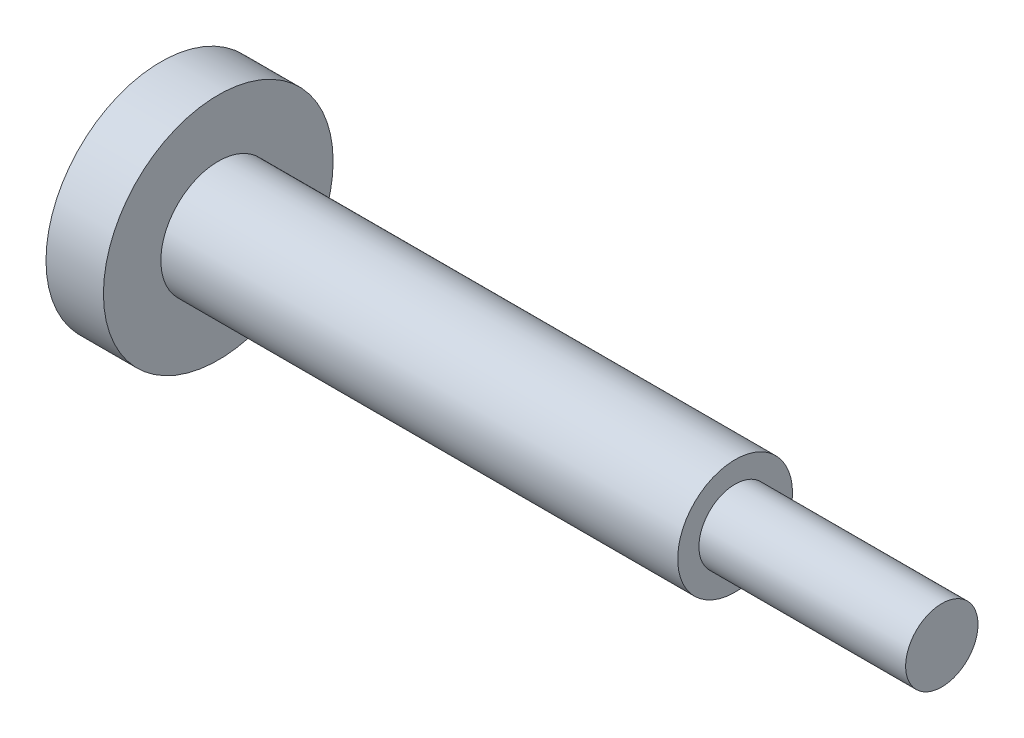
ISO-10303-21;
HEADER;
FILE_DESCRIPTION(('STEP AP214'),'2;1');
FILE_NAME('part.step','',(''),(''),'','','');
FILE_SCHEMA(('AUTOMOTIVE_DESIGN { 1 0 10303 214 1 1 1 1 }'));
ENDSEC;
DATA;
#1=APPLICATION_CONTEXT('core data for automotive mechanical design processes');
#2=APPLICATION_PROTOCOL_DEFINITION('international standard','automotive_design',2000,#1);
#3=PRODUCT_CONTEXT('',#1,'mechanical');
#4=PRODUCT('Part','Part','',(#3));
#5=PRODUCT_RELATED_PRODUCT_CATEGORY('part','',(#4));
#6=PRODUCT_DEFINITION_FORMATION('','',#4);
#7=PRODUCT_DEFINITION_CONTEXT('part definition',#1,'design');
#8=PRODUCT_DEFINITION('design','',#6,#7);
#9=PRODUCT_DEFINITION_SHAPE('','',#8);
#10=(LENGTH_UNIT() NAMED_UNIT(*) SI_UNIT(.MILLI.,.METRE.));
#11=(NAMED_UNIT(*) PLANE_ANGLE_UNIT() SI_UNIT($,.RADIAN.));
#12=(NAMED_UNIT(*) SI_UNIT($,.STERADIAN.) SOLID_ANGLE_UNIT());
#13=UNCERTAINTY_MEASURE_WITH_UNIT(LENGTH_MEASURE(1.E-05),#10,'distance_accuracy_value','');
#14=(GEOMETRIC_REPRESENTATION_CONTEXT(3) GLOBAL_UNCERTAINTY_ASSIGNED_CONTEXT((#13)) GLOBAL_UNIT_ASSIGNED_CONTEXT((#10,
#11,#12)) REPRESENTATION_CONTEXT('',''));
#15=CARTESIAN_POINT('',(0.,0.,0.));
#16=DIRECTION('',(0.,0.,1.));
#17=DIRECTION('',(1.,0.,0.));
#18=AXIS2_PLACEMENT_3D('',#15,#16,#17);
#19=CARTESIAN_POINT('',(11.43,0.,0.));
#20=DIRECTION('',(-1.,0.,0.));
#21=DIRECTION('',(0.,0.,1.));
#22=AXIS2_PLACEMENT_3D('',#19,#20,#21);
#23=CYLINDRICAL_SURFACE('',#22,2.);
#24=CARTESIAN_POINT('',(11.43,0.,0.));
#25=DIRECTION('',(1.,0.,0.));
#26=DIRECTION('',(0.,0.,-1.));
#27=AXIS2_PLACEMENT_3D('',#24,#25,#26);
#28=CIRCLE('',#27,2.);
#29=CARTESIAN_POINT('',(11.43,0.,-2.));
#30=VERTEX_POINT('',#29);
#31=EDGE_CURVE('E10',#30,#30,#28,.T.);
#32=ORIENTED_EDGE('',*,*,#31,.F.);
#33=EDGE_LOOP('',(#32));
#34=FACE_BOUND('',#33,.T.);
#35=CARTESIAN_POINT('',(0.,0.,0.));
#36=DIRECTION('',(1.,0.,0.));
#37=DIRECTION('',(0.,0.,-1.));
#38=AXIS2_PLACEMENT_3D('',#35,#36,#37);
#39=CIRCLE('',#38,2.);
#40=CARTESIAN_POINT('',(0.,0.,-2.));
#41=VERTEX_POINT('',#40);
#42=EDGE_CURVE('E38',#41,#41,#39,.T.);
#43=ORIENTED_EDGE('',*,*,#42,.T.);
#44=EDGE_LOOP('',(#43));
#45=FACE_BOUND('',#44,.T.);
#46=ADVANCED_FACE('F35',(#34,#45),#23,.T.);
#47=CARTESIAN_POINT('',(11.43,0.,0.));
#48=DIRECTION('',(1.,0.,0.));
#49=DIRECTION('',(0.,0.,-1.));
#50=AXIS2_PLACEMENT_3D('',#47,#48,#49);
#51=PLANE('',#50);
#52=ORIENTED_EDGE('',*,*,#31,.T.);
#53=EDGE_LOOP('',(#52));
#54=FACE_BOUND('',#53,.T.);
#55=ADVANCED_FACE('F78',(#54),#51,.T.);
#56=CARTESIAN_POINT('',(-28.575,0.,0.));
#57=DIRECTION('',(1.,0.,0.));
#58=DIRECTION('',(0.,0.,-1.));
#59=AXIS2_PLACEMENT_3D('',#56,#57,#58);
#60=CYLINDRICAL_SURFACE('',#59,3.175);
#61=CARTESIAN_POINT('',(-28.575,0.,0.));
#62=DIRECTION('',(1.,0.,0.));
#63=DIRECTION('',(0.,0.,-1.));
#64=AXIS2_PLACEMENT_3D('',#61,#62,#63);
#65=CIRCLE('',#64,3.175);
#66=CARTESIAN_POINT('',(-28.575,0.,-3.175));
#67=VERTEX_POINT('',#66);
#68=EDGE_CURVE('E49',#67,#67,#65,.T.);
#69=ORIENTED_EDGE('',*,*,#68,.T.);
#70=EDGE_LOOP('',(#69));
#71=FACE_BOUND('',#70,.T.);
#72=CARTESIAN_POINT('',(0.,0.,0.));
#73=DIRECTION('',(1.,0.,0.));
#74=DIRECTION('',(0.,0.,-1.));
#75=AXIS2_PLACEMENT_3D('',#72,#73,#74);
#76=CIRCLE('',#75,3.175);
#77=CARTESIAN_POINT('',(0.,0.,-3.175));
#78=VERTEX_POINT('',#77);
#79=EDGE_CURVE('E45',#78,#78,#76,.T.);
#80=ORIENTED_EDGE('',*,*,#79,.F.);
#81=EDGE_LOOP('',(#80));
#82=FACE_BOUND('',#81,.T.);
#83=ADVANCED_FACE('F83',(#71,#82),#60,.T.);
#84=CARTESIAN_POINT('',(0.,0.,0.));
#85=DIRECTION('',(1.,0.,0.));
#86=DIRECTION('',(0.,0.,-1.));
#87=AXIS2_PLACEMENT_3D('',#84,#85,#86);
#88=PLANE('',#87);
#89=ORIENTED_EDGE('',*,*,#42,.F.);
#90=EDGE_LOOP('',(#89));
#91=FACE_BOUND('',#90,.T.);
#92=ORIENTED_EDGE('',*,*,#79,.T.);
#93=EDGE_LOOP('',(#92));
#94=FACE_BOUND('',#93,.T.);
#95=ADVANCED_FACE('F64',(#91,#94),#88,.T.);
#96=CARTESIAN_POINT('',(-31.75,0.,0.));
#97=DIRECTION('',(1.,0.,0.));
#98=DIRECTION('',(0.,0.,-1.));
#99=AXIS2_PLACEMENT_3D('',#96,#97,#98);
#100=CYLINDRICAL_SURFACE('',#99,6.35);
#101=CARTESIAN_POINT('',(-31.75,0.,0.));
#102=DIRECTION('',(-1.,0.,0.));
#103=DIRECTION('',(0.,0.,1.));
#104=AXIS2_PLACEMENT_3D('',#101,#102,#103);
#105=CIRCLE('',#104,6.35);
#106=CARTESIAN_POINT('',(-31.75,0.,6.35));
#107=VERTEX_POINT('',#106);
#108=EDGE_CURVE('E52',#107,#107,#105,.T.);
#109=ORIENTED_EDGE('',*,*,#108,.F.);
#110=EDGE_LOOP('',(#109));
#111=FACE_BOUND('',#110,.T.);
#112=CARTESIAN_POINT('',(-28.575,0.,0.));
#113=DIRECTION('',(-1.,0.,0.));
#114=DIRECTION('',(0.,0.,1.));
#115=AXIS2_PLACEMENT_3D('',#112,#113,#114);
#116=CIRCLE('',#115,6.35);
#117=CARTESIAN_POINT('',(-28.575,0.,6.35));
#118=VERTEX_POINT('',#117);
#119=EDGE_CURVE('E53',#118,#118,#116,.T.);
#120=ORIENTED_EDGE('',*,*,#119,.T.);
#121=EDGE_LOOP('',(#120));
#122=FACE_BOUND('',#121,.T.);
#123=ADVANCED_FACE('F61',(#111,#122),#100,.T.);
#124=CARTESIAN_POINT('',(-31.75,0.,0.));
#125=DIRECTION('',(-1.,0.,0.));
#126=DIRECTION('',(0.,0.,1.));
#127=AXIS2_PLACEMENT_3D('',#124,#125,#126);
#128=PLANE('',#127);
#129=ORIENTED_EDGE('',*,*,#108,.T.);
#130=EDGE_LOOP('',(#129));
#131=FACE_BOUND('',#130,.T.);
#132=ADVANCED_FACE('F59',(#131),#128,.T.);
#133=CARTESIAN_POINT('',(-28.575,0.,0.));
#134=DIRECTION('',(-1.,0.,0.));
#135=DIRECTION('',(0.,0.,1.));
#136=AXIS2_PLACEMENT_3D('',#133,#134,#135);
#137=PLANE('',#136);
#138=ORIENTED_EDGE('',*,*,#68,.F.);
#139=EDGE_LOOP('',(#138));
#140=FACE_BOUND('',#139,.T.);
#141=ORIENTED_EDGE('',*,*,#119,.F.);
#142=EDGE_LOOP('',(#141));
#143=FACE_BOUND('',#142,.T.);
#144=ADVANCED_FACE('F68',(#140,#143),#137,.F.);
#145=CLOSED_SHELL('',(#46,#55,#83,#95,#123,#132,#144));
#146=MANIFOLD_SOLID_BREP('B2',#145);
#147=ADVANCED_BREP_SHAPE_REPRESENTATION('',(#18,#146),#14);
#148=SHAPE_DEFINITION_REPRESENTATION(#9,#147);
ENDSEC;
END-ISO-10303-21;
